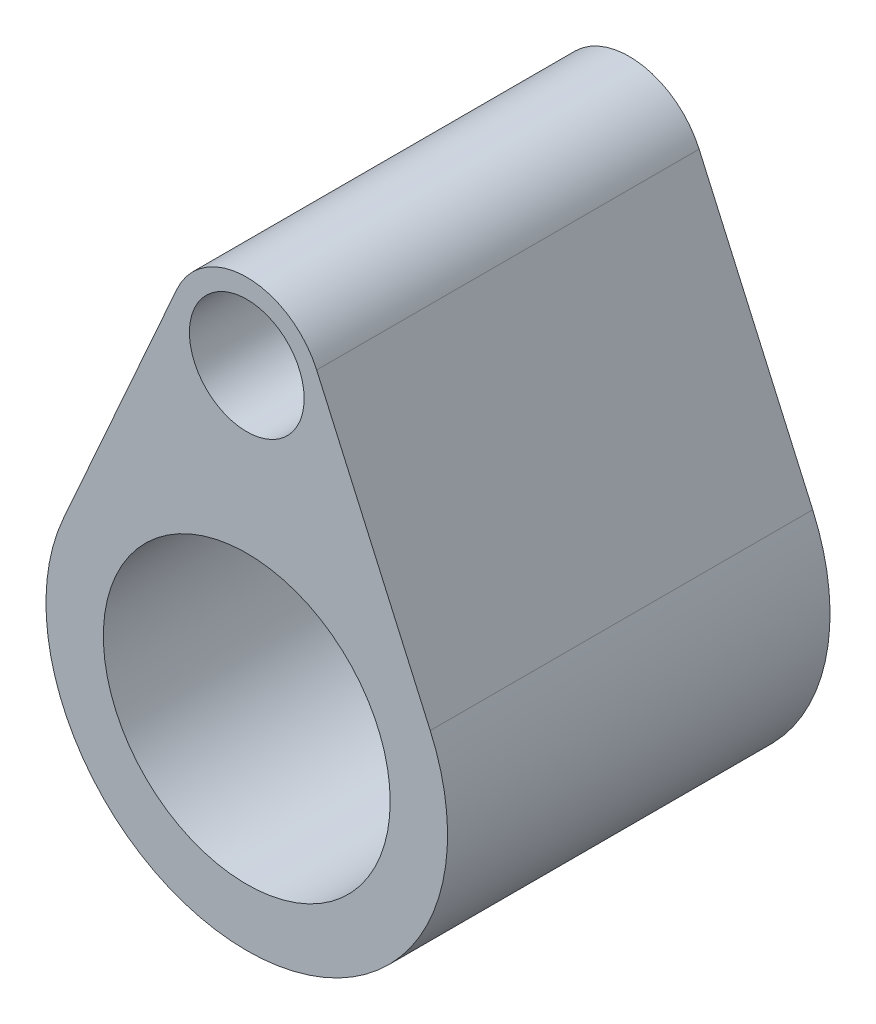
ISO-10303-21;
HEADER;
FILE_DESCRIPTION(('STEP AP214'),'2;1');
FILE_NAME('part.step','',(''),(''),'','','');
FILE_SCHEMA(('AUTOMOTIVE_DESIGN { 1 0 10303 214 1 1 1 1 }'));
ENDSEC;
DATA;
#1=APPLICATION_CONTEXT('core data for automotive mechanical design processes');
#2=APPLICATION_PROTOCOL_DEFINITION('international standard','automotive_design',2000,#1);
#3=PRODUCT_CONTEXT('',#1,'mechanical');
#4=PRODUCT('Part','Part','',(#3));
#5=PRODUCT_RELATED_PRODUCT_CATEGORY('part','',(#4));
#6=PRODUCT_DEFINITION_FORMATION('','',#4);
#7=PRODUCT_DEFINITION_CONTEXT('part definition',#1,'design');
#8=PRODUCT_DEFINITION('design','',#6,#7);
#9=PRODUCT_DEFINITION_SHAPE('','',#8);
#10=(LENGTH_UNIT() NAMED_UNIT(*) SI_UNIT(.MILLI.,.METRE.));
#11=(NAMED_UNIT(*) PLANE_ANGLE_UNIT() SI_UNIT($,.RADIAN.));
#12=(NAMED_UNIT(*) SI_UNIT($,.STERADIAN.) SOLID_ANGLE_UNIT());
#13=UNCERTAINTY_MEASURE_WITH_UNIT(LENGTH_MEASURE(1.E-05),#10,'distance_accuracy_value','');
#14=(GEOMETRIC_REPRESENTATION_CONTEXT(3) GLOBAL_UNCERTAINTY_ASSIGNED_CONTEXT((#13)) GLOBAL_UNIT_ASSIGNED_CONTEXT((#10,
#11,#12)) REPRESENTATION_CONTEXT('',''));
#15=CARTESIAN_POINT('',(0.,0.,0.));
#16=DIRECTION('',(0.,0.,1.));
#17=DIRECTION('',(1.,0.,0.));
#18=AXIS2_PLACEMENT_3D('',#15,#16,#17);
#19=CARTESIAN_POINT('',(0.,-160.,100.));
#20=DIRECTION('',(0.,0.,1.));
#21=DIRECTION('',(1.,0.,0.));
#22=AXIS2_PLACEMENT_3D('',#19,#20,#21);
#23=PLANE('',#22);
#24=CARTESIAN_POINT('',(0.,0.,100.));
#25=DIRECTION('',(0.,0.,1.));
#26=DIRECTION('',(1.,0.,0.));
#27=AXIS2_PLACEMENT_3D('',#24,#25,#26);
#28=CIRCLE('',#27,30.);
#29=CARTESIAN_POINT('',(30.,0.,100.));
#30=VERTEX_POINT('',#29);
#31=EDGE_CURVE('E122',#30,#30,#28,.T.);
#32=ORIENTED_EDGE('',*,*,#31,.F.);
#33=EDGE_LOOP('',(#32));
#34=FACE_BOUND('',#33,.T.);
#35=CARTESIAN_POINT('',(0.,-160.,100.));
#36=DIRECTION('',(0.,0.,1.));
#37=DIRECTION('',(1.,0.,0.));
#38=AXIS2_PLACEMENT_3D('',#35,#36,#37);
#39=CIRCLE('',#38,105.);
#40=CARTESIAN_POINT('',(-95.9450068317132,-117.34375,100.));
#41=VERTEX_POINT('',#40);
#42=CARTESIAN_POINT('',(95.9450068317133,-117.34375,100.));
#43=VERTEX_POINT('',#42);
#44=EDGE_CURVE('E89',#41,#43,#39,.T.);
#45=ORIENTED_EDGE('',*,*,#44,.T.);
#46=DIRECTION('',(-0.40625,0.91376196982584,0.));
#47=VECTOR('',#46,1.);
#48=CARTESIAN_POINT('',(36.5504787930336,16.25,100.));
#49=LINE('',#48,#47);
#50=CARTESIAN_POINT('',(36.5504787930336,16.25,100.));
#51=VERTEX_POINT('',#50);
#52=EDGE_CURVE('E84',#43,#51,#49,.T.);
#53=ORIENTED_EDGE('',*,*,#52,.T.);
#54=CARTESIAN_POINT('',(0.,0.,100.));
#55=DIRECTION('',(0.,0.,1.));
#56=DIRECTION('',(1.,0.,0.));
#57=AXIS2_PLACEMENT_3D('',#54,#55,#56);
#58=CIRCLE('',#57,40.);
#59=CARTESIAN_POINT('',(-36.5504787930336,16.25,100.));
#60=VERTEX_POINT('',#59);
#61=EDGE_CURVE('E87',#51,#60,#58,.T.);
#62=ORIENTED_EDGE('',*,*,#61,.T.);
#63=DIRECTION('',(-0.40625,-0.91376196982584,0.));
#64=VECTOR('',#63,1.);
#65=CARTESIAN_POINT('',(-95.9450068317132,-117.34375,100.));
#66=LINE('',#65,#64);
#67=EDGE_CURVE('E54',#60,#41,#66,.T.);
#68=ORIENTED_EDGE('',*,*,#67,.T.);
#69=EDGE_LOOP('',(#45,#53,#62,#68));
#70=FACE_BOUND('',#69,.T.);
#71=CARTESIAN_POINT('',(0.,-160.,100.));
#72=DIRECTION('',(0.,0.,1.));
#73=DIRECTION('',(1.,0.,0.));
#74=AXIS2_PLACEMENT_3D('',#71,#72,#73);
#75=CIRCLE('',#74,75.);
#76=CARTESIAN_POINT('',(75.,-160.,100.));
#77=VERTEX_POINT('',#76);
#78=EDGE_CURVE('E104',#77,#77,#75,.T.);
#79=ORIENTED_EDGE('',*,*,#78,.F.);
#80=EDGE_LOOP('',(#79));
#81=FACE_BOUND('',#80,.T.);
#82=ADVANCED_FACE('F37',(#34,#70,#81),#23,.T.);
#83=CARTESIAN_POINT('',(0.,-160.,-100.));
#84=DIRECTION('',(0.,0.,1.));
#85=DIRECTION('',(1.,0.,0.));
#86=AXIS2_PLACEMENT_3D('',#83,#84,#85);
#87=PLANE('',#86);
#88=CARTESIAN_POINT('',(0.,0.,-100.));
#89=DIRECTION('',(0.,0.,1.));
#90=DIRECTION('',(1.,0.,0.));
#91=AXIS2_PLACEMENT_3D('',#88,#89,#90);
#92=CIRCLE('',#91,30.);
#93=CARTESIAN_POINT('',(30.,0.,-100.));
#94=VERTEX_POINT('',#93);
#95=EDGE_CURVE('E119',#94,#94,#92,.T.);
#96=ORIENTED_EDGE('',*,*,#95,.T.);
#97=EDGE_LOOP('',(#96));
#98=FACE_BOUND('',#97,.T.);
#99=CARTESIAN_POINT('',(0.,-160.,-100.));
#100=DIRECTION('',(0.,0.,1.));
#101=DIRECTION('',(1.,0.,0.));
#102=AXIS2_PLACEMENT_3D('',#99,#100,#101);
#103=CIRCLE('',#102,105.);
#104=CARTESIAN_POINT('',(-95.9450068317132,-117.34375,-100.));
#105=VERTEX_POINT('',#104);
#106=CARTESIAN_POINT('',(95.9450068317133,-117.34375,-100.));
#107=VERTEX_POINT('',#106);
#108=EDGE_CURVE('E101',#105,#107,#103,.T.);
#109=ORIENTED_EDGE('',*,*,#108,.F.);
#110=DIRECTION('',(-0.40625,-0.91376196982584,0.));
#111=VECTOR('',#110,1.);
#112=CARTESIAN_POINT('',(-95.9450068317132,-117.34375,-100.));
#113=LINE('',#112,#111);
#114=CARTESIAN_POINT('',(-36.5504787930336,16.25,-100.));
#115=VERTEX_POINT('',#114);
#116=EDGE_CURVE('E77',#115,#105,#113,.T.);
#117=ORIENTED_EDGE('',*,*,#116,.F.);
#118=CARTESIAN_POINT('',(0.,0.,-100.));
#119=DIRECTION('',(0.,0.,1.));
#120=DIRECTION('',(1.,0.,0.));
#121=AXIS2_PLACEMENT_3D('',#118,#119,#120);
#122=CIRCLE('',#121,40.);
#123=CARTESIAN_POINT('',(36.5504787930336,16.25,-100.));
#124=VERTEX_POINT('',#123);
#125=EDGE_CURVE('E71',#124,#115,#122,.T.);
#126=ORIENTED_EDGE('',*,*,#125,.F.);
#127=DIRECTION('',(-0.40625,0.91376196982584,0.));
#128=VECTOR('',#127,1.);
#129=CARTESIAN_POINT('',(36.5504787930336,16.25,-100.));
#130=LINE('',#129,#128);
#131=EDGE_CURVE('E93',#107,#124,#130,.T.);
#132=ORIENTED_EDGE('',*,*,#131,.F.);
#133=EDGE_LOOP('',(#109,#117,#126,#132));
#134=FACE_BOUND('',#133,.T.);
#135=CARTESIAN_POINT('',(0.,-160.,-100.));
#136=DIRECTION('',(0.,0.,1.));
#137=DIRECTION('',(1.,0.,0.));
#138=AXIS2_PLACEMENT_3D('',#135,#136,#137);
#139=CIRCLE('',#138,75.);
#140=CARTESIAN_POINT('',(75.,-160.,-100.));
#141=VERTEX_POINT('',#140);
#142=EDGE_CURVE('E116',#141,#141,#139,.T.);
#143=ORIENTED_EDGE('',*,*,#142,.T.);
#144=EDGE_LOOP('',(#143));
#145=FACE_BOUND('',#144,.T.);
#146=ADVANCED_FACE('F112',(#98,#134,#145),#87,.F.);
#147=CARTESIAN_POINT('',(0.,-160.,100.));
#148=DIRECTION('',(0.,0.,-1.));
#149=DIRECTION('',(-1.,0.,0.));
#150=AXIS2_PLACEMENT_3D('',#147,#148,#149);
#151=CYLINDRICAL_SURFACE('',#150,105.);
#152=ORIENTED_EDGE('',*,*,#108,.T.);
#153=DIRECTION('',(0.,0.,-1.));
#154=VECTOR('',#153,1.);
#155=CARTESIAN_POINT('',(95.9450068317133,-117.34375,100.));
#156=LINE('',#155,#154);
#157=EDGE_CURVE('E11',#43,#107,#156,.T.);
#158=ORIENTED_EDGE('',*,*,#157,.F.);
#159=ORIENTED_EDGE('',*,*,#44,.F.);
#160=DIRECTION('',(0.,0.,-1.));
#161=VECTOR('',#160,1.);
#162=CARTESIAN_POINT('',(-95.9450068317132,-117.34375,100.));
#163=LINE('',#162,#161);
#164=EDGE_CURVE('E97',#41,#105,#163,.T.);
#165=ORIENTED_EDGE('',*,*,#164,.T.);
#166=EDGE_LOOP('',(#152,#158,#159,#165));
#167=FACE_BOUND('',#166,.T.);
#168=ADVANCED_FACE('F39',(#167),#151,.T.);
#169=CARTESIAN_POINT('',(36.5504787930336,16.25,100.));
#170=DIRECTION('',(-0.91376196982584,-0.40625,0.));
#171=DIRECTION('',(0.40625,-0.91376196982584,0.));
#172=AXIS2_PLACEMENT_3D('',#169,#170,#171);
#173=PLANE('',#172);
#174=ORIENTED_EDGE('',*,*,#131,.T.);
#175=DIRECTION('',(0.,0.,-1.));
#176=VECTOR('',#175,1.);
#177=CARTESIAN_POINT('',(36.5504787930336,16.25,100.));
#178=LINE('',#177,#176);
#179=EDGE_CURVE('E46',#51,#124,#178,.T.);
#180=ORIENTED_EDGE('',*,*,#179,.F.);
#181=ORIENTED_EDGE('',*,*,#52,.F.);
#182=ORIENTED_EDGE('',*,*,#157,.T.);
#183=EDGE_LOOP('',(#174,#180,#181,#182));
#184=FACE_BOUND('',#183,.T.);
#185=ADVANCED_FACE('F92',(#184),#173,.F.);
#186=CARTESIAN_POINT('',(0.,0.,100.));
#187=DIRECTION('',(0.,0.,-1.));
#188=DIRECTION('',(-1.,0.,0.));
#189=AXIS2_PLACEMENT_3D('',#186,#187,#188);
#190=CYLINDRICAL_SURFACE('',#189,40.);
#191=ORIENTED_EDGE('',*,*,#125,.T.);
#192=DIRECTION('',(0.,0.,-1.));
#193=VECTOR('',#192,1.);
#194=CARTESIAN_POINT('',(-36.5504787930336,16.25,100.));
#195=LINE('',#194,#193);
#196=EDGE_CURVE('E94',#60,#115,#195,.T.);
#197=ORIENTED_EDGE('',*,*,#196,.F.);
#198=ORIENTED_EDGE('',*,*,#61,.F.);
#199=ORIENTED_EDGE('',*,*,#179,.T.);
#200=EDGE_LOOP('',(#191,#197,#198,#199));
#201=FACE_BOUND('',#200,.T.);
#202=ADVANCED_FACE('F95',(#201),#190,.T.);
#203=CARTESIAN_POINT('',(-95.9450068317132,-117.34375,100.));
#204=DIRECTION('',(0.91376196982584,-0.40625,0.));
#205=DIRECTION('',(0.40625,0.91376196982584,0.));
#206=AXIS2_PLACEMENT_3D('',#203,#204,#205);
#207=PLANE('',#206);
#208=ORIENTED_EDGE('',*,*,#116,.T.);
#209=ORIENTED_EDGE('',*,*,#164,.F.);
#210=ORIENTED_EDGE('',*,*,#67,.F.);
#211=ORIENTED_EDGE('',*,*,#196,.T.);
#212=EDGE_LOOP('',(#208,#209,#210,#211));
#213=FACE_BOUND('',#212,.T.);
#214=ADVANCED_FACE('F109',(#213),#207,.F.);
#215=CARTESIAN_POINT('',(0.,-160.,100.));
#216=DIRECTION('',(0.,0.,-1.));
#217=DIRECTION('',(-1.,0.,0.));
#218=AXIS2_PLACEMENT_3D('',#215,#216,#217);
#219=CYLINDRICAL_SURFACE('',#218,75.);
#220=ORIENTED_EDGE('',*,*,#78,.T.);
#221=EDGE_LOOP('',(#220));
#222=FACE_BOUND('',#221,.T.);
#223=ORIENTED_EDGE('',*,*,#142,.F.);
#224=EDGE_LOOP('',(#223));
#225=FACE_BOUND('',#224,.T.);
#226=ADVANCED_FACE('F132',(#222,#225),#219,.F.);
#227=CARTESIAN_POINT('',(0.,0.,-100.));
#228=DIRECTION('',(0.,0.,1.));
#229=DIRECTION('',(1.,0.,0.));
#230=AXIS2_PLACEMENT_3D('',#227,#228,#229);
#231=CYLINDRICAL_SURFACE('',#230,30.);
#232=ORIENTED_EDGE('',*,*,#95,.F.);
#233=EDGE_LOOP('',(#232));
#234=FACE_BOUND('',#233,.T.);
#235=ORIENTED_EDGE('',*,*,#31,.T.);
#236=EDGE_LOOP('',(#235));
#237=FACE_BOUND('',#236,.T.);
#238=ADVANCED_FACE('F129',(#234,#237),#231,.F.);
#239=CLOSED_SHELL('',(#82,#146,#168,#185,#202,#214,#226,#238));
#240=MANIFOLD_SOLID_BREP('B2',#239);
#241=ADVANCED_BREP_SHAPE_REPRESENTATION('',(#18,#240),#14);
#242=SHAPE_DEFINITION_REPRESENTATION(#9,#241);
ENDSEC;
END-ISO-10303-21;
